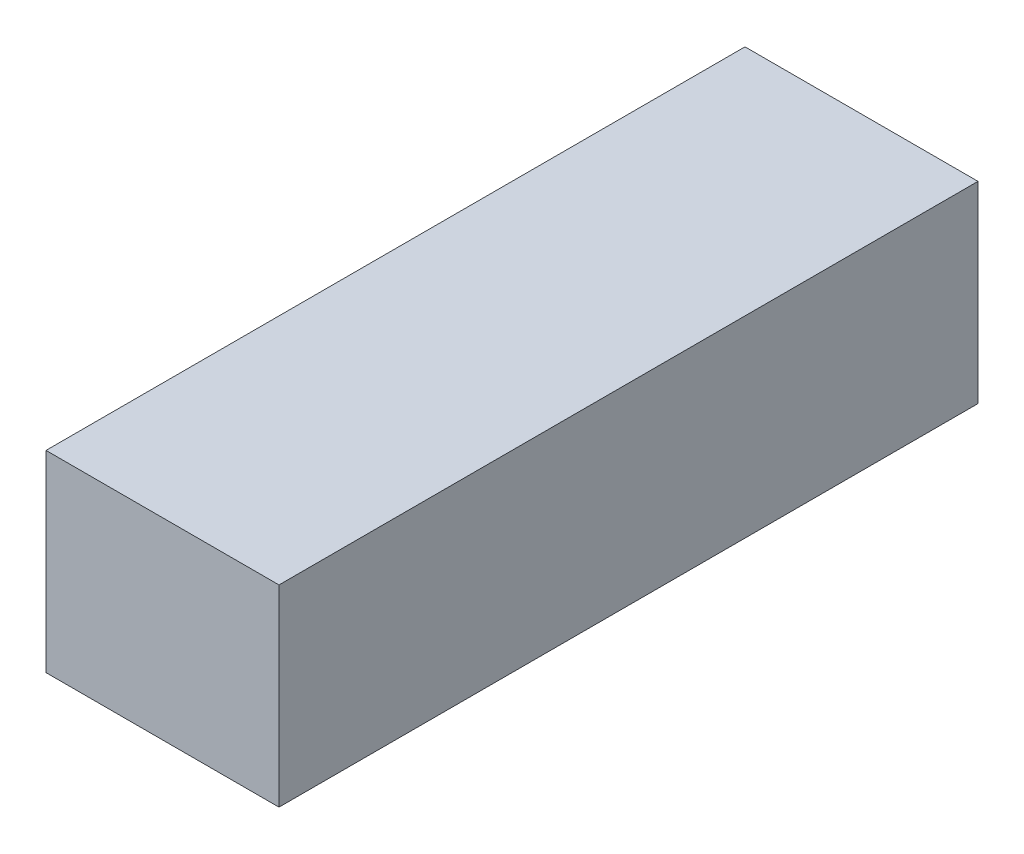
ISO-10303-21;
HEADER;
FILE_DESCRIPTION(('STEP AP214'),'2;1');
FILE_NAME('part.step','',(''),(''),'','','');
FILE_SCHEMA(('AUTOMOTIVE_DESIGN { 1 0 10303 214 1 1 1 1 }'));
ENDSEC;
DATA;
#1=APPLICATION_CONTEXT('core data for automotive mechanical design processes');
#2=APPLICATION_PROTOCOL_DEFINITION('international standard','automotive_design',2000,#1);
#3=PRODUCT_CONTEXT('',#1,'mechanical');
#4=PRODUCT('Part','Part','',(#3));
#5=PRODUCT_RELATED_PRODUCT_CATEGORY('part','',(#4));
#6=PRODUCT_DEFINITION_FORMATION('','',#4);
#7=PRODUCT_DEFINITION_CONTEXT('part definition',#1,'design');
#8=PRODUCT_DEFINITION('design','',#6,#7);
#9=PRODUCT_DEFINITION_SHAPE('','',#8);
#10=(LENGTH_UNIT() NAMED_UNIT(*) SI_UNIT(.MILLI.,.METRE.));
#11=(NAMED_UNIT(*) PLANE_ANGLE_UNIT() SI_UNIT($,.RADIAN.));
#12=(NAMED_UNIT(*) SI_UNIT($,.STERADIAN.) SOLID_ANGLE_UNIT());
#13=UNCERTAINTY_MEASURE_WITH_UNIT(LENGTH_MEASURE(1.E-05),#10,'distance_accuracy_value','');
#14=(GEOMETRIC_REPRESENTATION_CONTEXT(3) GLOBAL_UNCERTAINTY_ASSIGNED_CONTEXT((#13)) GLOBAL_UNIT_ASSIGNED_CONTEXT((#10,
#11,#12)) REPRESENTATION_CONTEXT('',''));
#15=CARTESIAN_POINT('',(0.,0.,0.));
#16=DIRECTION('',(0.,0.,1.));
#17=DIRECTION('',(1.,0.,0.));
#18=AXIS2_PLACEMENT_3D('',#15,#16,#17);
#19=CARTESIAN_POINT('',(0.,38.,0.));
#20=DIRECTION('',(0.,0.,1.));
#21=DIRECTION('',(1.,0.,0.));
#22=AXIS2_PLACEMENT_3D('',#19,#20,#21);
#23=PLANE('',#22);
#24=DIRECTION('',(-1.,0.,0.));
#25=VECTOR('',#24,1.);
#26=CARTESIAN_POINT('',(0.,0.,0.));
#27=LINE('',#26,#25);
#28=CARTESIAN_POINT('',(0.,0.,0.));
#29=VERTEX_POINT('',#28);
#30=CARTESIAN_POINT('',(-46.,0.,0.));
#31=VERTEX_POINT('',#30);
#32=EDGE_CURVE('E101',#29,#31,#27,.T.);
#33=ORIENTED_EDGE('',*,*,#32,.T.);
#34=DIRECTION('',(0.,-1.,0.));
#35=VECTOR('',#34,1.);
#36=CARTESIAN_POINT('',(-46.,38.,0.));
#37=LINE('',#36,#35);
#38=CARTESIAN_POINT('',(-46.,38.,0.));
#39=VERTEX_POINT('',#38);
#40=EDGE_CURVE('E11',#39,#31,#37,.T.);
#41=ORIENTED_EDGE('',*,*,#40,.F.);
#42=DIRECTION('',(-1.,0.,0.));
#43=VECTOR('',#42,1.);
#44=CARTESIAN_POINT('',(0.,38.,0.));
#45=LINE('',#44,#43);
#46=CARTESIAN_POINT('',(0.,38.,0.));
#47=VERTEX_POINT('',#46);
#48=EDGE_CURVE('E89',#47,#39,#45,.T.);
#49=ORIENTED_EDGE('',*,*,#48,.F.);
#50=DIRECTION('',(0.,-1.,0.));
#51=VECTOR('',#50,1.);
#52=CARTESIAN_POINT('',(0.,38.,0.));
#53=LINE('',#52,#51);
#54=EDGE_CURVE('E97',#47,#29,#53,.T.);
#55=ORIENTED_EDGE('',*,*,#54,.T.);
#56=EDGE_LOOP('',(#33,#41,#49,#55));
#57=FACE_BOUND('',#56,.T.);
#58=ADVANCED_FACE('F38',(#57),#23,.F.);
#59=CARTESIAN_POINT('',(-46.,38.,0.));
#60=DIRECTION('',(1.,0.,0.));
#61=DIRECTION('',(0.,0.,-1.));
#62=AXIS2_PLACEMENT_3D('',#59,#60,#61);
#63=PLANE('',#62);
#64=DIRECTION('',(0.,0.,1.));
#65=VECTOR('',#64,1.);
#66=CARTESIAN_POINT('',(-46.,0.,0.));
#67=LINE('',#66,#65);
#68=CARTESIAN_POINT('',(-46.,0.,138.));
#69=VERTEX_POINT('',#68);
#70=EDGE_CURVE('E93',#31,#69,#67,.T.);
#71=ORIENTED_EDGE('',*,*,#70,.T.);
#72=DIRECTION('',(0.,-1.,0.));
#73=VECTOR('',#72,1.);
#74=CARTESIAN_POINT('',(-46.,38.,138.));
#75=LINE('',#74,#73);
#76=CARTESIAN_POINT('',(-46.,38.,138.));
#77=VERTEX_POINT('',#76);
#78=EDGE_CURVE('E46',#77,#69,#75,.T.);
#79=ORIENTED_EDGE('',*,*,#78,.F.);
#80=DIRECTION('',(0.,0.,1.));
#81=VECTOR('',#80,1.);
#82=CARTESIAN_POINT('',(-46.,38.,0.));
#83=LINE('',#82,#81);
#84=EDGE_CURVE('E84',#39,#77,#83,.T.);
#85=ORIENTED_EDGE('',*,*,#84,.F.);
#86=ORIENTED_EDGE('',*,*,#40,.T.);
#87=EDGE_LOOP('',(#71,#79,#85,#86));
#88=FACE_BOUND('',#87,.T.);
#89=ADVANCED_FACE('F92',(#88),#63,.F.);
#90=CARTESIAN_POINT('',(0.,38.,138.));
#91=DIRECTION('',(0.,0.,-1.));
#92=DIRECTION('',(-1.,0.,0.));
#93=AXIS2_PLACEMENT_3D('',#90,#91,#92);
#94=PLANE('',#93);
#95=DIRECTION('',(1.,0.,0.));
#96=VECTOR('',#95,1.);
#97=CARTESIAN_POINT('',(0.,0.,138.));
#98=LINE('',#97,#96);
#99=CARTESIAN_POINT('',(0.,0.,138.));
#100=VERTEX_POINT('',#99);
#101=EDGE_CURVE('E71',#69,#100,#98,.T.);
#102=ORIENTED_EDGE('',*,*,#101,.T.);
#103=DIRECTION('',(0.,-1.,0.));
#104=VECTOR('',#103,1.);
#105=CARTESIAN_POINT('',(0.,38.,138.));
#106=LINE('',#105,#104);
#107=CARTESIAN_POINT('',(0.,38.,138.));
#108=VERTEX_POINT('',#107);
#109=EDGE_CURVE('E94',#108,#100,#106,.T.);
#110=ORIENTED_EDGE('',*,*,#109,.F.);
#111=DIRECTION('',(1.,0.,0.));
#112=VECTOR('',#111,1.);
#113=CARTESIAN_POINT('',(0.,38.,138.));
#114=LINE('',#113,#112);
#115=EDGE_CURVE('E87',#77,#108,#114,.T.);
#116=ORIENTED_EDGE('',*,*,#115,.F.);
#117=ORIENTED_EDGE('',*,*,#78,.T.);
#118=EDGE_LOOP('',(#102,#110,#116,#117));
#119=FACE_BOUND('',#118,.T.);
#120=ADVANCED_FACE('F95',(#119),#94,.F.);
#121=CARTESIAN_POINT('',(0.,38.,0.));
#122=DIRECTION('',(-1.,0.,0.));
#123=DIRECTION('',(0.,0.,1.));
#124=AXIS2_PLACEMENT_3D('',#121,#122,#123);
#125=PLANE('',#124);
#126=DIRECTION('',(0.,0.,-1.));
#127=VECTOR('',#126,1.);
#128=CARTESIAN_POINT('',(0.,0.,0.));
#129=LINE('',#128,#127);
#130=EDGE_CURVE('E77',#100,#29,#129,.T.);
#131=ORIENTED_EDGE('',*,*,#130,.T.);
#132=ORIENTED_EDGE('',*,*,#54,.F.);
#133=DIRECTION('',(0.,0.,-1.));
#134=VECTOR('',#133,1.);
#135=CARTESIAN_POINT('',(0.,38.,0.));
#136=LINE('',#135,#134);
#137=EDGE_CURVE('E54',#108,#47,#136,.T.);
#138=ORIENTED_EDGE('',*,*,#137,.F.);
#139=ORIENTED_EDGE('',*,*,#109,.T.);
#140=EDGE_LOOP('',(#131,#132,#138,#139));
#141=FACE_BOUND('',#140,.T.);
#142=ADVANCED_FACE('F108',(#141),#125,.F.);
#143=CARTESIAN_POINT('',(0.,38.,0.));
#144=DIRECTION('',(0.,1.,0.));
#145=DIRECTION('',(0.,0.,1.));
#146=AXIS2_PLACEMENT_3D('',#143,#144,#145);
#147=PLANE('',#146);
#148=ORIENTED_EDGE('',*,*,#48,.T.);
#149=ORIENTED_EDGE('',*,*,#84,.T.);
#150=ORIENTED_EDGE('',*,*,#115,.T.);
#151=ORIENTED_EDGE('',*,*,#137,.T.);
#152=EDGE_LOOP('',(#148,#149,#150,#151));
#153=FACE_BOUND('',#152,.T.);
#154=ADVANCED_FACE('F85',(#153),#147,.T.);
#155=CARTESIAN_POINT('',(0.,0.,0.));
#156=DIRECTION('',(0.,1.,0.));
#157=DIRECTION('',(0.,0.,1.));
#158=AXIS2_PLACEMENT_3D('',#155,#156,#157);
#159=PLANE('',#158);
#160=ORIENTED_EDGE('',*,*,#32,.F.);
#161=ORIENTED_EDGE('',*,*,#130,.F.);
#162=ORIENTED_EDGE('',*,*,#101,.F.);
#163=ORIENTED_EDGE('',*,*,#70,.F.);
#164=EDGE_LOOP('',(#160,#161,#162,#163));
#165=FACE_BOUND('',#164,.T.);
#166=ADVANCED_FACE('F111',(#165),#159,.F.);
#167=CLOSED_SHELL('',(#58,#89,#120,#142,#154,#166));
#168=MANIFOLD_SOLID_BREP('B2',#167);
#169=ADVANCED_BREP_SHAPE_REPRESENTATION('',(#18,#168),#14);
#170=SHAPE_DEFINITION_REPRESENTATION(#9,#169);
ENDSEC;
END-ISO-10303-21;
